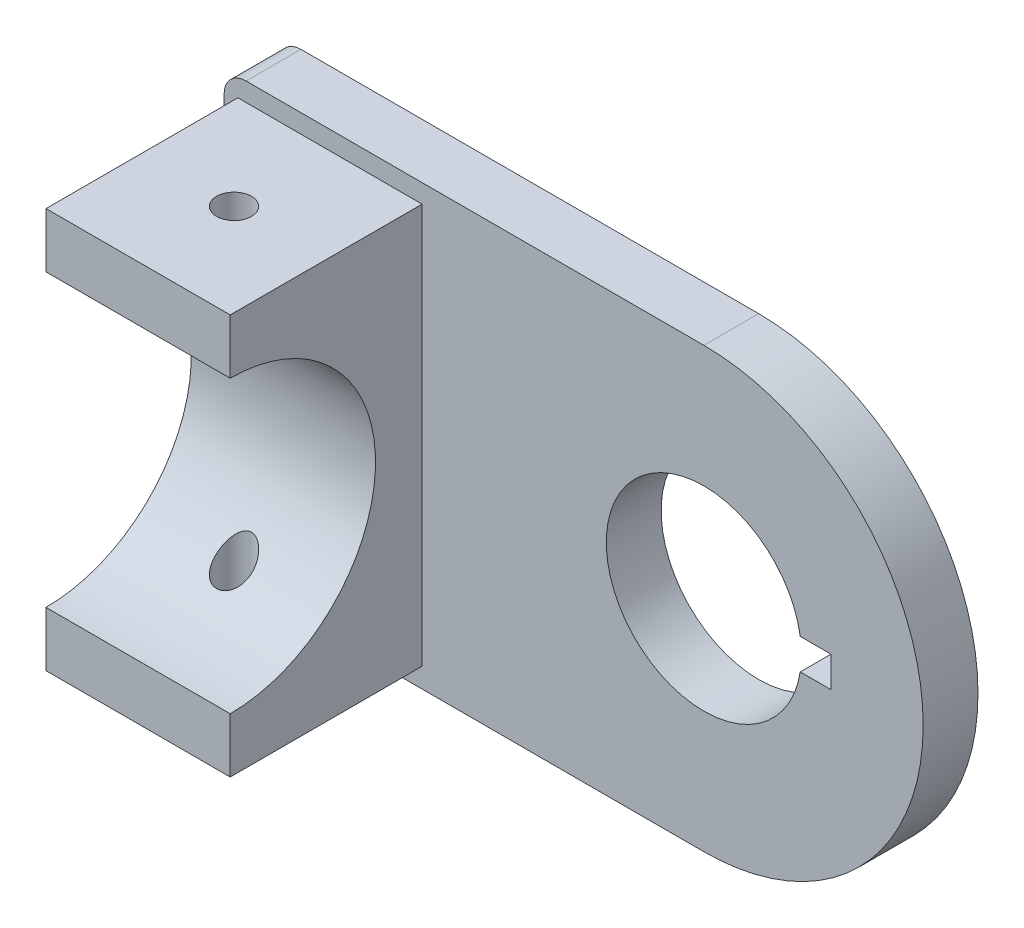
ISO-10303-21;
HEADER;
FILE_DESCRIPTION(('STEP AP214'),'2;1');
FILE_NAME('part.step','',(''),(''),'','','');
FILE_SCHEMA(('AUTOMOTIVE_DESIGN { 1 0 10303 214 1 1 1 1 }'));
ENDSEC;
DATA;
#1=APPLICATION_CONTEXT('core data for automotive mechanical design processes');
#2=APPLICATION_PROTOCOL_DEFINITION('international standard','automotive_design',2000,#1);
#3=PRODUCT_CONTEXT('',#1,'mechanical');
#4=PRODUCT('Part','Part','',(#3));
#5=PRODUCT_RELATED_PRODUCT_CATEGORY('part','',(#4));
#6=PRODUCT_DEFINITION_FORMATION('','',#4);
#7=PRODUCT_DEFINITION_CONTEXT('part definition',#1,'design');
#8=PRODUCT_DEFINITION('design','',#6,#7);
#9=PRODUCT_DEFINITION_SHAPE('','',#8);
#10=(LENGTH_UNIT() NAMED_UNIT(*) SI_UNIT(.MILLI.,.METRE.));
#11=(NAMED_UNIT(*) PLANE_ANGLE_UNIT() SI_UNIT($,.RADIAN.));
#12=(NAMED_UNIT(*) SI_UNIT($,.STERADIAN.) SOLID_ANGLE_UNIT());
#13=UNCERTAINTY_MEASURE_WITH_UNIT(LENGTH_MEASURE(1.E-05),#10,'distance_accuracy_value','');
#14=(GEOMETRIC_REPRESENTATION_CONTEXT(3) GLOBAL_UNCERTAINTY_ASSIGNED_CONTEXT((#13)) GLOBAL_UNIT_ASSIGNED_CONTEXT((#10,
#11,#12)) REPRESENTATION_CONTEXT('',''));
#15=CARTESIAN_POINT('',(0.,0.,0.));
#16=DIRECTION('',(0.,0.,1.));
#17=DIRECTION('',(1.,0.,0.));
#18=AXIS2_PLACEMENT_3D('',#15,#16,#17);
#19=CARTESIAN_POINT('',(0.,0.,28.575));
#20=DIRECTION('',(0.,0.,-1.));
#21=DIRECTION('',(-1.,0.,0.));
#22=AXIS2_PLACEMENT_3D('',#19,#20,#21);
#23=PLANE('',#22);
#24=DIRECTION('',(1.,0.,0.));
#25=VECTOR('',#24,1.);
#26=CARTESIAN_POINT('',(-190.581497037959,8.636,28.575));
#27=LINE('',#26,#25);
#28=CARTESIAN_POINT('',(1.58749999999999,8.636,28.575));
#29=VERTEX_POINT('',#28);
#30=CARTESIAN_POINT('',(22.9235,8.636,28.575));
#31=VERTEX_POINT('',#30);
#32=EDGE_CURVE('E56',#29,#31,#27,.T.);
#33=ORIENTED_EDGE('',*,*,#32,.F.);
#34=DIRECTION('',(0.,-1.,0.));
#35=VECTOR('',#34,1.);
#36=CARTESIAN_POINT('',(1.5875,2.286,28.575));
#37=LINE('',#36,#35);
#38=CARTESIAN_POINT('',(1.5875,2.286,28.575));
#39=VERTEX_POINT('',#38);
#40=EDGE_CURVE('E164',#29,#39,#37,.T.);
#41=ORIENTED_EDGE('',*,*,#40,.T.);
#42=DIRECTION('',(1.,0.,0.));
#43=VECTOR('',#42,1.);
#44=CARTESIAN_POINT('',(1.5875,2.286,28.575));
#45=LINE('',#44,#43);
#46=CARTESIAN_POINT('',(22.9235,2.286,28.575));
#47=VERTEX_POINT('',#46);
#48=EDGE_CURVE('E177',#39,#47,#45,.T.);
#49=ORIENTED_EDGE('',*,*,#48,.T.);
#50=DIRECTION('',(0.,1.,0.));
#51=VECTOR('',#50,1.);
#52=CARTESIAN_POINT('',(22.9235,2.286,28.575));
#53=LINE('',#52,#51);
#54=EDGE_CURVE('E167',#47,#31,#53,.T.);
#55=ORIENTED_EDGE('',*,*,#54,.T.);
#56=EDGE_LOOP('',(#33,#41,#49,#55));
#57=FACE_BOUND('',#56,.T.);
#58=ADVANCED_FACE('F41',(#57),#23,.F.);
#59=CARTESIAN_POINT('',(1.5875,2.286,28.575));
#60=DIRECTION('',(1.,0.,0.));
#61=DIRECTION('',(0.,0.,-1.));
#62=AXIS2_PLACEMENT_3D('',#59,#60,#61);
#63=PLANE('',#62);
#64=CARTESIAN_POINT('',(1.58749999999999,25.4635,28.575));
#65=DIRECTION('',(1.,0.,0.));
#66=DIRECTION('',(0.,0.,-1.));
#67=AXIS2_PLACEMENT_3D('',#64,#65,#66);
#68=CIRCLE('',#67,16.8275);
#69=CARTESIAN_POINT('',(1.58749999999999,42.291,28.575));
#70=VERTEX_POINT('',#69);
#71=EDGE_CURVE('E152',#70,#29,#68,.F.);
#72=ORIENTED_EDGE('',*,*,#71,.F.);
#73=CARTESIAN_POINT('',(1.5875,48.641,28.575));
#74=VERTEX_POINT('',#73);
#75=EDGE_CURVE('E174',#74,#70,#37,.T.);
#76=ORIENTED_EDGE('',*,*,#75,.F.);
#77=DIRECTION('',(0.,0.,-1.));
#78=VECTOR('',#77,1.);
#79=CARTESIAN_POINT('',(1.5875,48.641,28.575));
#80=LINE('',#79,#78);
#81=CARTESIAN_POINT('',(1.5875,48.641,6.35));
#82=VERTEX_POINT('',#81);
#83=EDGE_CURVE('E187',#74,#82,#80,.T.);
#84=ORIENTED_EDGE('',*,*,#83,.T.);
#85=DIRECTION('',(0.,-1.,0.));
#86=VECTOR('',#85,1.);
#87=CARTESIAN_POINT('',(1.5875,2.286,6.35));
#88=LINE('',#87,#86);
#89=CARTESIAN_POINT('',(1.5875,2.286,6.35));
#90=VERTEX_POINT('',#89);
#91=EDGE_CURVE('E168',#82,#90,#88,.T.);
#92=ORIENTED_EDGE('',*,*,#91,.T.);
#93=DIRECTION('',(0.,0.,-1.));
#94=VECTOR('',#93,1.);
#95=CARTESIAN_POINT('',(1.5875,2.286,28.575));
#96=LINE('',#95,#94);
#97=EDGE_CURVE('E173',#39,#90,#96,.T.);
#98=ORIENTED_EDGE('',*,*,#97,.F.);
#99=ORIENTED_EDGE('',*,*,#40,.F.);
#100=EDGE_LOOP('',(#72,#76,#84,#92,#98,#99));
#101=FACE_BOUND('',#100,.T.);
#102=ADVANCED_FACE('F171',(#101),#63,.F.);
#103=CARTESIAN_POINT('',(55.5625,25.4,6.35));
#104=DIRECTION('',(0.,0.,1.));
#105=DIRECTION('',(1.,0.,0.));
#106=AXIS2_PLACEMENT_3D('',#103,#104,#105);
#107=PLANE('',#106);
#108=CARTESIAN_POINT('',(55.5625,25.4,6.35));
#109=DIRECTION('',(0.,0.,1.));
#110=DIRECTION('',(1.,0.,0.));
#111=AXIS2_PLACEMENT_3D('',#108,#109,#110);
#112=CIRCLE('',#111,25.4);
#113=CARTESIAN_POINT('',(55.5625,0.,6.35));
#114=VERTEX_POINT('',#113);
#115=CARTESIAN_POINT('',(55.5625,50.8,6.35));
#116=VERTEX_POINT('',#115);
#117=EDGE_CURVE('E231',#114,#116,#112,.T.);
#118=ORIENTED_EDGE('',*,*,#117,.T.);
#119=DIRECTION('',(-1.,0.,0.));
#120=VECTOR('',#119,1.);
#121=CARTESIAN_POINT('',(2.54000000000002,50.8,6.35));
#122=LINE('',#121,#120);
#123=CARTESIAN_POINT('',(2.54000000000002,50.8,6.35));
#124=VERTEX_POINT('',#123);
#125=EDGE_CURVE('E234',#116,#124,#122,.T.);
#126=ORIENTED_EDGE('',*,*,#125,.T.);
#127=CARTESIAN_POINT('',(2.54,48.26,6.35));
#128=DIRECTION('',(0.,0.,1.));
#129=DIRECTION('',(1.,0.,0.));
#130=AXIS2_PLACEMENT_3D('',#127,#128,#129);
#131=CIRCLE('',#130,2.54);
#132=CARTESIAN_POINT('',(0.,48.26,6.35));
#133=VERTEX_POINT('',#132);
#134=EDGE_CURVE('E237',#124,#133,#131,.T.);
#135=ORIENTED_EDGE('',*,*,#134,.T.);
#136=DIRECTION('',(0.,-1.,0.));
#137=VECTOR('',#136,1.);
#138=CARTESIAN_POINT('',(0.,2.54000000000002,6.35));
#139=LINE('',#138,#137);
#140=CARTESIAN_POINT('',(0.,2.54000000000002,6.35));
#141=VERTEX_POINT('',#140);
#142=EDGE_CURVE('E239',#133,#141,#139,.T.);
#143=ORIENTED_EDGE('',*,*,#142,.T.);
#144=CARTESIAN_POINT('',(2.54,2.54,6.35));
#145=DIRECTION('',(0.,0.,1.));
#146=DIRECTION('',(-1.,0.,0.));
#147=AXIS2_PLACEMENT_3D('',#144,#145,#146);
#148=CIRCLE('',#147,2.54);
#149=CARTESIAN_POINT('',(2.54000000000002,0.,6.35));
#150=VERTEX_POINT('',#149);
#151=EDGE_CURVE('E241',#141,#150,#148,.T.);
#152=ORIENTED_EDGE('',*,*,#151,.T.);
#153=DIRECTION('',(1.,0.,0.));
#154=VECTOR('',#153,1.);
#155=CARTESIAN_POINT('',(2.54000000000002,0.,6.35));
#156=LINE('',#155,#154);
#157=EDGE_CURVE('E243',#150,#114,#156,.T.);
#158=ORIENTED_EDGE('',*,*,#157,.T.);
#159=EDGE_LOOP('',(#118,#126,#135,#143,#152,#158));
#160=FACE_BOUND('',#159,.T.);
#161=DIRECTION('',(1.,0.,0.));
#162=VECTOR('',#161,1.);
#163=CARTESIAN_POINT('',(70.2807813528418,23.622,6.35));
#164=LINE('',#163,#162);
#165=CARTESIAN_POINT('',(66.7247813528418,23.622,6.35));
#166=VERTEX_POINT('',#165);
#167=CARTESIAN_POINT('',(70.2807813528418,23.622,6.35));
#168=VERTEX_POINT('',#167);
#169=EDGE_CURVE('E202',#166,#168,#164,.T.);
#170=ORIENTED_EDGE('',*,*,#169,.F.);
#171=CARTESIAN_POINT('',(55.5625,25.4,6.35));
#172=DIRECTION('',(0.,0.,1.));
#173=DIRECTION('',(1.,0.,0.));
#174=AXIS2_PLACEMENT_3D('',#171,#172,#173);
#175=CIRCLE('',#174,11.303);
#176=CARTESIAN_POINT('',(66.7247813528418,27.178,6.35));
#177=VERTEX_POINT('',#176);
#178=EDGE_CURVE('E200',#177,#166,#175,.T.);
#179=ORIENTED_EDGE('',*,*,#178,.F.);
#180=DIRECTION('',(-1.,0.,0.));
#181=VECTOR('',#180,1.);
#182=CARTESIAN_POINT('',(66.7247813528418,27.178,6.35));
#183=LINE('',#182,#181);
#184=CARTESIAN_POINT('',(70.2807813528418,27.178,6.35));
#185=VERTEX_POINT('',#184);
#186=EDGE_CURVE('E208',#185,#177,#183,.T.);
#187=ORIENTED_EDGE('',*,*,#186,.F.);
#188=DIRECTION('',(0.,1.,0.));
#189=VECTOR('',#188,1.);
#190=CARTESIAN_POINT('',(70.2807813528418,27.178,6.35));
#191=LINE('',#190,#189);
#192=EDGE_CURVE('E205',#168,#185,#191,.T.);
#193=ORIENTED_EDGE('',*,*,#192,.F.);
#194=EDGE_LOOP('',(#170,#179,#187,#193));
#195=FACE_BOUND('',#194,.T.);
#196=DIRECTION('',(1.,0.,0.));
#197=VECTOR('',#196,1.);
#198=CARTESIAN_POINT('',(1.5875,2.286,6.35));
#199=LINE('',#198,#197);
#200=CARTESIAN_POINT('',(22.9235,2.286,6.35));
#201=VERTEX_POINT('',#200);
#202=EDGE_CURVE('E189',#90,#201,#199,.T.);
#203=ORIENTED_EDGE('',*,*,#202,.F.);
#204=ORIENTED_EDGE('',*,*,#91,.F.);
#205=DIRECTION('',(-1.,0.,0.));
#206=VECTOR('',#205,1.);
#207=CARTESIAN_POINT('',(1.5875,48.641,6.35));
#208=LINE('',#207,#206);
#209=CARTESIAN_POINT('',(22.9235,48.641,6.35));
#210=VERTEX_POINT('',#209);
#211=EDGE_CURVE('E175',#210,#82,#208,.T.);
#212=ORIENTED_EDGE('',*,*,#211,.F.);
#213=DIRECTION('',(0.,1.,0.));
#214=VECTOR('',#213,1.);
#215=CARTESIAN_POINT('',(22.9235,2.286,6.35));
#216=LINE('',#215,#214);
#217=EDGE_CURVE('E178',#201,#210,#216,.T.);
#218=ORIENTED_EDGE('',*,*,#217,.F.);
#219=EDGE_LOOP('',(#203,#204,#212,#218));
#220=FACE_BOUND('',#219,.T.);
#221=ADVANCED_FACE('F296',(#160,#195,#220),#107,.T.);
#222=CARTESIAN_POINT('',(55.5625,25.4,0.));
#223=DIRECTION('',(0.,0.,1.));
#224=DIRECTION('',(1.,0.,0.));
#225=AXIS2_PLACEMENT_3D('',#222,#223,#224);
#226=PLANE('',#225);
#227=CARTESIAN_POINT('',(55.5625,25.4,0.));
#228=DIRECTION('',(0.,0.,1.));
#229=DIRECTION('',(1.,0.,0.));
#230=AXIS2_PLACEMENT_3D('',#227,#228,#229);
#231=CIRCLE('',#230,25.4);
#232=CARTESIAN_POINT('',(55.5625,0.,0.));
#233=VERTEX_POINT('',#232);
#234=CARTESIAN_POINT('',(55.5625,50.8,0.));
#235=VERTEX_POINT('',#234);
#236=EDGE_CURVE('E230',#233,#235,#231,.T.);
#237=ORIENTED_EDGE('',*,*,#236,.F.);
#238=DIRECTION('',(1.,0.,0.));
#239=VECTOR('',#238,1.);
#240=CARTESIAN_POINT('',(2.54000000000002,0.,0.));
#241=LINE('',#240,#239);
#242=CARTESIAN_POINT('',(2.54000000000002,0.,0.));
#243=VERTEX_POINT('',#242);
#244=EDGE_CURVE('E235',#243,#233,#241,.T.);
#245=ORIENTED_EDGE('',*,*,#244,.F.);
#246=CARTESIAN_POINT('',(2.54,2.54,0.));
#247=DIRECTION('',(0.,0.,1.));
#248=DIRECTION('',(-1.,0.,0.));
#249=AXIS2_PLACEMENT_3D('',#246,#247,#248);
#250=CIRCLE('',#249,2.54);
#251=CARTESIAN_POINT('',(0.,2.54000000000002,0.));
#252=VERTEX_POINT('',#251);
#253=EDGE_CURVE('E254',#252,#243,#250,.T.);
#254=ORIENTED_EDGE('',*,*,#253,.F.);
#255=DIRECTION('',(0.,-1.,0.));
#256=VECTOR('',#255,1.);
#257=CARTESIAN_POINT('',(0.,2.54000000000002,0.));
#258=LINE('',#257,#256);
#259=CARTESIAN_POINT('',(0.,48.26,0.));
#260=VERTEX_POINT('',#259);
#261=EDGE_CURVE('E252',#260,#252,#258,.T.);
#262=ORIENTED_EDGE('',*,*,#261,.F.);
#263=CARTESIAN_POINT('',(2.54,48.26,0.));
#264=DIRECTION('',(0.,0.,1.));
#265=DIRECTION('',(1.,0.,0.));
#266=AXIS2_PLACEMENT_3D('',#263,#264,#265);
#267=CIRCLE('',#266,2.54);
#268=CARTESIAN_POINT('',(2.54000000000002,50.8,0.));
#269=VERTEX_POINT('',#268);
#270=EDGE_CURVE('E250',#269,#260,#267,.T.);
#271=ORIENTED_EDGE('',*,*,#270,.F.);
#272=DIRECTION('',(-1.,0.,0.));
#273=VECTOR('',#272,1.);
#274=CARTESIAN_POINT('',(2.54000000000002,50.8,0.));
#275=LINE('',#274,#273);
#276=EDGE_CURVE('E248',#235,#269,#275,.T.);
#277=ORIENTED_EDGE('',*,*,#276,.F.);
#278=EDGE_LOOP('',(#237,#245,#254,#262,#271,#277));
#279=FACE_BOUND('',#278,.T.);
#280=CARTESIAN_POINT('',(55.5625,25.4,0.));
#281=DIRECTION('',(0.,0.,1.));
#282=DIRECTION('',(1.,0.,0.));
#283=AXIS2_PLACEMENT_3D('',#280,#281,#282);
#284=CIRCLE('',#283,11.303);
#285=CARTESIAN_POINT('',(66.7247813528418,27.178,0.));
#286=VERTEX_POINT('',#285);
#287=CARTESIAN_POINT('',(66.7247813528418,23.622,0.));
#288=VERTEX_POINT('',#287);
#289=EDGE_CURVE('E199',#286,#288,#284,.T.);
#290=ORIENTED_EDGE('',*,*,#289,.T.);
#291=DIRECTION('',(1.,0.,0.));
#292=VECTOR('',#291,1.);
#293=CARTESIAN_POINT('',(70.2807813528418,23.622,0.));
#294=LINE('',#293,#292);
#295=CARTESIAN_POINT('',(70.2807813528418,23.622,0.));
#296=VERTEX_POINT('',#295);
#297=EDGE_CURVE('E213',#288,#296,#294,.T.);
#298=ORIENTED_EDGE('',*,*,#297,.T.);
#299=DIRECTION('',(0.,1.,0.));
#300=VECTOR('',#299,1.);
#301=CARTESIAN_POINT('',(70.2807813528418,27.178,0.));
#302=LINE('',#301,#300);
#303=CARTESIAN_POINT('',(70.2807813528418,27.178,0.));
#304=VERTEX_POINT('',#303);
#305=EDGE_CURVE('E216',#296,#304,#302,.T.);
#306=ORIENTED_EDGE('',*,*,#305,.T.);
#307=DIRECTION('',(-1.,0.,0.));
#308=VECTOR('',#307,1.);
#309=CARTESIAN_POINT('',(66.7247813528418,27.178,0.));
#310=LINE('',#309,#308);
#311=EDGE_CURVE('E203',#304,#286,#310,.T.);
#312=ORIENTED_EDGE('',*,*,#311,.T.);
#313=EDGE_LOOP('',(#290,#298,#306,#312));
#314=FACE_BOUND('',#313,.T.);
#315=ADVANCED_FACE('F281',(#279,#314),#226,.F.);
#316=CARTESIAN_POINT('',(55.5625,25.4,6.35));
#317=DIRECTION('',(0.,0.,-1.));
#318=DIRECTION('',(-1.,0.,0.));
#319=AXIS2_PLACEMENT_3D('',#316,#317,#318);
#320=CYLINDRICAL_SURFACE('',#319,25.4);
#321=ORIENTED_EDGE('',*,*,#236,.T.);
#322=DIRECTION('',(0.,0.,-1.));
#323=VECTOR('',#322,1.);
#324=CARTESIAN_POINT('',(55.5625,50.8,6.35));
#325=LINE('',#324,#323);
#326=EDGE_CURVE('E49',#116,#235,#325,.T.);
#327=ORIENTED_EDGE('',*,*,#326,.F.);
#328=ORIENTED_EDGE('',*,*,#117,.F.);
#329=DIRECTION('',(0.,0.,-1.));
#330=VECTOR('',#329,1.);
#331=CARTESIAN_POINT('',(55.5625,0.,6.35));
#332=LINE('',#331,#330);
#333=EDGE_CURVE('E245',#114,#233,#332,.T.);
#334=ORIENTED_EDGE('',*,*,#333,.T.);
#335=EDGE_LOOP('',(#321,#327,#328,#334));
#336=FACE_BOUND('',#335,.T.);
#337=ADVANCED_FACE('F43',(#336),#320,.T.);
#338=CARTESIAN_POINT('',(2.54000000000002,50.8,6.35));
#339=DIRECTION('',(0.,-1.,0.));
#340=DIRECTION('',(0.,0.,-1.));
#341=AXIS2_PLACEMENT_3D('',#338,#339,#340);
#342=PLANE('',#341);
#343=ORIENTED_EDGE('',*,*,#276,.T.);
#344=DIRECTION('',(0.,0.,-1.));
#345=VECTOR('',#344,1.);
#346=CARTESIAN_POINT('',(2.54000000000002,50.8,6.35));
#347=LINE('',#346,#345);
#348=EDGE_CURVE('E268',#124,#269,#347,.T.);
#349=ORIENTED_EDGE('',*,*,#348,.F.);
#350=ORIENTED_EDGE('',*,*,#125,.F.);
#351=ORIENTED_EDGE('',*,*,#326,.T.);
#352=EDGE_LOOP('',(#343,#349,#350,#351));
#353=FACE_BOUND('',#352,.T.);
#354=ADVANCED_FACE('F273',(#353),#342,.F.);
#355=CARTESIAN_POINT('',(2.54,48.26,6.35));
#356=DIRECTION('',(0.,0.,-1.));
#357=DIRECTION('',(-1.,0.,0.));
#358=AXIS2_PLACEMENT_3D('',#355,#356,#357);
#359=CYLINDRICAL_SURFACE('',#358,2.54);
#360=ORIENTED_EDGE('',*,*,#270,.T.);
#361=DIRECTION('',(0.,0.,-1.));
#362=VECTOR('',#361,1.);
#363=CARTESIAN_POINT('',(0.,48.26,6.35));
#364=LINE('',#363,#362);
#365=EDGE_CURVE('E265',#133,#260,#364,.T.);
#366=ORIENTED_EDGE('',*,*,#365,.F.);
#367=ORIENTED_EDGE('',*,*,#134,.F.);
#368=ORIENTED_EDGE('',*,*,#348,.T.);
#369=EDGE_LOOP('',(#360,#366,#367,#368));
#370=FACE_BOUND('',#369,.T.);
#371=ADVANCED_FACE('F288',(#370),#359,.T.);
#372=CARTESIAN_POINT('',(0.,2.54000000000002,6.35));
#373=DIRECTION('',(1.,0.,0.));
#374=DIRECTION('',(0.,0.,-1.));
#375=AXIS2_PLACEMENT_3D('',#372,#373,#374);
#376=PLANE('',#375);
#377=ORIENTED_EDGE('',*,*,#261,.T.);
#378=DIRECTION('',(0.,0.,-1.));
#379=VECTOR('',#378,1.);
#380=CARTESIAN_POINT('',(0.,2.54000000000002,6.35));
#381=LINE('',#380,#379);
#382=EDGE_CURVE('E262',#141,#252,#381,.T.);
#383=ORIENTED_EDGE('',*,*,#382,.F.);
#384=ORIENTED_EDGE('',*,*,#142,.F.);
#385=ORIENTED_EDGE('',*,*,#365,.T.);
#386=EDGE_LOOP('',(#377,#383,#384,#385));
#387=FACE_BOUND('',#386,.T.);
#388=ADVANCED_FACE('F292',(#387),#376,.F.);
#389=CARTESIAN_POINT('',(2.54,2.54,6.35));
#390=DIRECTION('',(0.,0.,-1.));
#391=DIRECTION('',(-1.,0.,0.));
#392=AXIS2_PLACEMENT_3D('',#389,#390,#391);
#393=CYLINDRICAL_SURFACE('',#392,2.54);
#394=ORIENTED_EDGE('',*,*,#253,.T.);
#395=DIRECTION('',(0.,0.,-1.));
#396=VECTOR('',#395,1.);
#397=CARTESIAN_POINT('',(2.54000000000002,0.,6.35));
#398=LINE('',#397,#396);
#399=EDGE_CURVE('E259',#150,#243,#398,.T.);
#400=ORIENTED_EDGE('',*,*,#399,.F.);
#401=ORIENTED_EDGE('',*,*,#151,.F.);
#402=ORIENTED_EDGE('',*,*,#382,.T.);
#403=EDGE_LOOP('',(#394,#400,#401,#402));
#404=FACE_BOUND('',#403,.T.);
#405=ADVANCED_FACE('F303',(#404),#393,.T.);
#406=CARTESIAN_POINT('',(2.54000000000002,0.,6.35));
#407=DIRECTION('',(0.,1.,0.));
#408=DIRECTION('',(0.,0.,1.));
#409=AXIS2_PLACEMENT_3D('',#406,#407,#408);
#410=PLANE('',#409);
#411=ORIENTED_EDGE('',*,*,#244,.T.);
#412=ORIENTED_EDGE('',*,*,#333,.F.);
#413=ORIENTED_EDGE('',*,*,#157,.F.);
#414=ORIENTED_EDGE('',*,*,#399,.T.);
#415=EDGE_LOOP('',(#411,#412,#413,#414));
#416=FACE_BOUND('',#415,.T.);
#417=ADVANCED_FACE('F301',(#416),#410,.F.);
#418=CARTESIAN_POINT('',(55.5625,25.4,6.35));
#419=DIRECTION('',(0.,0.,-1.));
#420=DIRECTION('',(-1.,0.,0.));
#421=AXIS2_PLACEMENT_3D('',#418,#419,#420);
#422=CYLINDRICAL_SURFACE('',#421,11.303);
#423=ORIENTED_EDGE('',*,*,#289,.F.);
#424=DIRECTION('',(0.,0.,-1.));
#425=VECTOR('',#424,1.);
#426=CARTESIAN_POINT('',(66.7247813528418,27.178,6.35));
#427=LINE('',#426,#425);
#428=EDGE_CURVE('E210',#177,#286,#427,.T.);
#429=ORIENTED_EDGE('',*,*,#428,.F.);
#430=ORIENTED_EDGE('',*,*,#178,.T.);
#431=DIRECTION('',(0.,0.,-1.));
#432=VECTOR('',#431,1.);
#433=CARTESIAN_POINT('',(66.7247813528418,23.622,6.35));
#434=LINE('',#433,#432);
#435=EDGE_CURVE('E227',#166,#288,#434,.T.);
#436=ORIENTED_EDGE('',*,*,#435,.T.);
#437=EDGE_LOOP('',(#423,#429,#430,#436));
#438=FACE_BOUND('',#437,.T.);
#439=ADVANCED_FACE('F310',(#438),#422,.F.);
#440=CARTESIAN_POINT('',(70.2807813528418,23.622,6.35));
#441=DIRECTION('',(0.,1.,0.));
#442=DIRECTION('',(-1.,0.,0.));
#443=AXIS2_PLACEMENT_3D('',#440,#441,#442);
#444=PLANE('',#443);
#445=ORIENTED_EDGE('',*,*,#297,.F.);
#446=ORIENTED_EDGE('',*,*,#435,.F.);
#447=ORIENTED_EDGE('',*,*,#169,.T.);
#448=DIRECTION('',(0.,0.,-1.));
#449=VECTOR('',#448,1.);
#450=CARTESIAN_POINT('',(70.2807813528418,23.622,6.35));
#451=LINE('',#450,#449);
#452=EDGE_CURVE('E225',#168,#296,#451,.T.);
#453=ORIENTED_EDGE('',*,*,#452,.T.);
#454=EDGE_LOOP('',(#445,#446,#447,#453));
#455=FACE_BOUND('',#454,.T.);
#456=ADVANCED_FACE('F359',(#455),#444,.T.);
#457=CARTESIAN_POINT('',(70.2807813528418,27.178,6.35));
#458=DIRECTION('',(-1.,0.,0.));
#459=DIRECTION('',(0.,0.,1.));
#460=AXIS2_PLACEMENT_3D('',#457,#458,#459);
#461=PLANE('',#460);
#462=ORIENTED_EDGE('',*,*,#305,.F.);
#463=ORIENTED_EDGE('',*,*,#452,.F.);
#464=ORIENTED_EDGE('',*,*,#192,.T.);
#465=DIRECTION('',(0.,0.,-1.));
#466=VECTOR('',#465,1.);
#467=CARTESIAN_POINT('',(70.2807813528418,27.178,6.35));
#468=LINE('',#467,#466);
#469=EDGE_CURVE('E223',#185,#304,#468,.T.);
#470=ORIENTED_EDGE('',*,*,#469,.T.);
#471=EDGE_LOOP('',(#462,#463,#464,#470));
#472=FACE_BOUND('',#471,.T.);
#473=ADVANCED_FACE('F355',(#472),#461,.T.);
#474=CARTESIAN_POINT('',(66.7247813528418,27.178,6.35));
#475=DIRECTION('',(0.,-1.,0.));
#476=DIRECTION('',(0.,0.,-1.));
#477=AXIS2_PLACEMENT_3D('',#474,#475,#476);
#478=PLANE('',#477);
#479=ORIENTED_EDGE('',*,*,#311,.F.);
#480=ORIENTED_EDGE('',*,*,#469,.F.);
#481=ORIENTED_EDGE('',*,*,#186,.T.);
#482=ORIENTED_EDGE('',*,*,#428,.T.);
#483=EDGE_LOOP('',(#479,#480,#481,#482));
#484=FACE_BOUND('',#483,.T.);
#485=ADVANCED_FACE('F349',(#484),#478,.T.);
#486=CARTESIAN_POINT('',(1.5875,2.286,28.575));
#487=DIRECTION('',(0.,1.,0.));
#488=DIRECTION('',(0.,0.,1.));
#489=AXIS2_PLACEMENT_3D('',#486,#487,#488);
#490=PLANE('',#489);
#491=CARTESIAN_POINT('',(12.2555,2.286,17.4625));
#492=DIRECTION('',(0.,-1.,0.));
#493=DIRECTION('',(0.,0.,-1.));
#494=AXIS2_PLACEMENT_3D('',#491,#492,#493);
#495=CIRCLE('',#494,2.0193);
#496=CARTESIAN_POINT('',(12.2555,2.286,15.4432));
#497=VERTEX_POINT('',#496);
#498=EDGE_CURVE('E530',#497,#497,#495,.T.);
#499=ORIENTED_EDGE('',*,*,#498,.F.);
#500=EDGE_LOOP('',(#499));
#501=FACE_BOUND('',#500,.T.);
#502=ORIENTED_EDGE('',*,*,#202,.T.);
#503=DIRECTION('',(0.,0.,-1.));
#504=VECTOR('',#503,1.);
#505=CARTESIAN_POINT('',(22.9235,2.286,28.575));
#506=LINE('',#505,#504);
#507=EDGE_CURVE('E195',#47,#201,#506,.T.);
#508=ORIENTED_EDGE('',*,*,#507,.F.);
#509=ORIENTED_EDGE('',*,*,#48,.F.);
#510=ORIENTED_EDGE('',*,*,#97,.T.);
#511=EDGE_LOOP('',(#502,#508,#509,#510));
#512=FACE_BOUND('',#511,.T.);
#513=ADVANCED_FACE('F342',(#501,#512),#490,.F.);
#514=CARTESIAN_POINT('',(22.9235,2.286,28.575));
#515=DIRECTION('',(-1.,0.,0.));
#516=DIRECTION('',(0.,0.,1.));
#517=AXIS2_PLACEMENT_3D('',#514,#515,#516);
#518=PLANE('',#517);
#519=CARTESIAN_POINT('',(22.9235,42.291,28.575));
#520=VERTEX_POINT('',#519);
#521=CARTESIAN_POINT('',(22.9235,48.641,28.575));
#522=VERTEX_POINT('',#521);
#523=EDGE_CURVE('E183',#520,#522,#53,.T.);
#524=ORIENTED_EDGE('',*,*,#523,.F.);
#525=CARTESIAN_POINT('',(22.9235,25.4635,28.575));
#526=DIRECTION('',(-1.,0.,0.));
#527=DIRECTION('',(0.,0.,1.));
#528=AXIS2_PLACEMENT_3D('',#525,#526,#527);
#529=CIRCLE('',#528,16.8275);
#530=EDGE_CURVE('E11',#520,#31,#529,.T.);
#531=ORIENTED_EDGE('',*,*,#530,.T.);
#532=ORIENTED_EDGE('',*,*,#54,.F.);
#533=ORIENTED_EDGE('',*,*,#507,.T.);
#534=ORIENTED_EDGE('',*,*,#217,.T.);
#535=DIRECTION('',(0.,0.,-1.));
#536=VECTOR('',#535,1.);
#537=CARTESIAN_POINT('',(22.9235,48.641,28.575));
#538=LINE('',#537,#536);
#539=EDGE_CURVE('E63',#522,#210,#538,.T.);
#540=ORIENTED_EDGE('',*,*,#539,.F.);
#541=EDGE_LOOP('',(#524,#531,#532,#533,#534,#540));
#542=FACE_BOUND('',#541,.T.);
#543=ADVANCED_FACE('F331',(#542),#518,.F.);
#544=CARTESIAN_POINT('',(1.5875,48.641,28.575));
#545=DIRECTION('',(0.,-1.,0.));
#546=DIRECTION('',(0.,0.,-1.));
#547=AXIS2_PLACEMENT_3D('',#544,#545,#546);
#548=PLANE('',#547);
#549=CARTESIAN_POINT('',(12.2555,48.641,17.4625));
#550=DIRECTION('',(0.,1.,0.));
#551=DIRECTION('',(0.,0.,1.));
#552=AXIS2_PLACEMENT_3D('',#549,#550,#551);
#553=CIRCLE('',#552,2.0193);
#554=CARTESIAN_POINT('',(12.2555,48.641,19.4818));
#555=VERTEX_POINT('',#554);
#556=EDGE_CURVE('E529',#555,#555,#553,.T.);
#557=ORIENTED_EDGE('',*,*,#556,.F.);
#558=EDGE_LOOP('',(#557));
#559=FACE_BOUND('',#558,.T.);
#560=ORIENTED_EDGE('',*,*,#211,.T.);
#561=ORIENTED_EDGE('',*,*,#83,.F.);
#562=DIRECTION('',(-1.,0.,0.));
#563=VECTOR('',#562,1.);
#564=CARTESIAN_POINT('',(1.5875,48.641,28.575));
#565=LINE('',#564,#563);
#566=EDGE_CURVE('E185',#522,#74,#565,.T.);
#567=ORIENTED_EDGE('',*,*,#566,.F.);
#568=ORIENTED_EDGE('',*,*,#539,.T.);
#569=EDGE_LOOP('',(#560,#561,#567,#568));
#570=FACE_BOUND('',#569,.T.);
#571=ADVANCED_FACE('F323',(#559,#570),#548,.F.);
#572=ORIENTED_EDGE('',*,*,#75,.T.);
#573=DIRECTION('',(1.,0.,0.));
#574=VECTOR('',#573,1.);
#575=CARTESIAN_POINT('',(-190.581497037959,42.291,28.575));
#576=LINE('',#575,#574);
#577=EDGE_CURVE('E155',#70,#520,#576,.T.);
#578=ORIENTED_EDGE('',*,*,#577,.T.);
#579=ORIENTED_EDGE('',*,*,#523,.T.);
#580=ORIENTED_EDGE('',*,*,#566,.T.);
#581=EDGE_LOOP('',(#572,#578,#579,#580));
#582=FACE_BOUND('',#581,.T.);
#583=ADVANCED_FACE('F315',(#582),#23,.F.);
#584=CARTESIAN_POINT('',(-190.581497037959,25.4635,28.575));
#585=DIRECTION('',(1.,0.,0.));
#586=DIRECTION('',(0.,0.,-1.));
#587=AXIS2_PLACEMENT_3D('',#584,#585,#586);
#588=CYLINDRICAL_SURFACE('',#587,16.8275);
#589=CARTESIAN_POINT('',(12.2555,14.9411150512348,15.4432));
#590=CARTESIAN_POINT('',(12.1699356578506,14.9411016415711,15.4432095513431));
#591=CARTESIAN_POINT('',(12.0842790674387,14.9342354369666,15.4487034848355));
#592=CARTESIAN_POINT('',(11.9162874318763,14.9076405279394,15.4700828695973));
#593=CARTESIAN_POINT('',(11.8339596398287,14.8878851909982,15.4859898373088));
#594=CARTESIAN_POINT('',(11.6759039524595,14.8379895266229,15.5264641373657));
#595=CARTESIAN_POINT('',(11.6001153554763,14.8079614844578,15.5509378953145));
#596=CARTESIAN_POINT('',(11.4551476471965,14.7398610551267,15.6069518368225));
#597=CARTESIAN_POINT('',(11.3859710611018,14.7017856122532,15.6384947048944));
#598=CARTESIAN_POINT('',(11.2168925456849,14.5962577251542,15.7268559200963));
#599=CARTESIAN_POINT('',(11.1219199883849,14.5244215926134,15.7878402525376));
#600=CARTESIAN_POINT('',(10.9476151950222,14.3716887999855,15.9200896976639));
#601=CARTESIAN_POINT('',(10.8683278227812,14.2907671589523,15.9913833189319));
#602=CARTESIAN_POINT('',(10.744759628862,14.1472159794849,16.1205629049773));
#603=CARTESIAN_POINT('',(10.6969181006546,14.0858798199822,16.1765440686466));
#604=CARTESIAN_POINT('',(10.6084352610237,13.9613185572277,16.2920114291321));
#605=CARTESIAN_POINT('',(10.5677969447037,13.8980926809392,16.3514990703098));
#606=CARTESIAN_POINT('',(10.456352187871,13.7066481535002,16.5345583532337));
#607=CARTESIAN_POINT('',(10.3959893234008,13.576630601312,16.6627549361332));
#608=CARTESIAN_POINT('',(10.3020619520853,13.3135002016262,16.9311850409237));
#609=CARTESIAN_POINT('',(10.2690928285601,13.1803801795529,17.0716161581752));
#610=CARTESIAN_POINT('',(10.2336642883027,12.9173046869057,17.3591379206127));
#611=CARTESIAN_POINT('',(10.231178080716,12.7873465377091,17.5062226039574));
#612=CARTESIAN_POINT('',(10.2572642796044,12.5545119955642,17.7791824999932));
#613=CARTESIAN_POINT('',(10.2809159236202,12.4506366869016,17.9046729802457));
#614=CARTESIAN_POINT('',(10.3538746179003,12.2501100296306,18.1540334608993));
#615=CARTESIAN_POINT('',(10.4031527696218,12.1534506838277,18.2779051258431));
#616=CARTESIAN_POINT('',(10.5167995235386,11.9884623585828,18.4951716415236));
#617=CARTESIAN_POINT('',(10.5762543671984,11.9183116627291,18.5897478821959));
#618=CARTESIAN_POINT('',(10.7134917034809,11.7864142508431,18.7711940637232));
#619=CARTESIAN_POINT('',(10.7912538615288,11.724658329633,18.8580724085913));
#620=CARTESIAN_POINT('',(10.9511675290728,11.6204423115763,19.0072685088447));
#621=CARTESIAN_POINT('',(11.0307299794908,11.5764749572505,19.0713023737583));
#622=CARTESIAN_POINT('',(11.2016730663091,11.4972557392276,19.1881070027119));
#623=CARTESIAN_POINT('',(11.2930503583586,11.4620014173794,19.2408809428655));
#624=CARTESIAN_POINT('',(11.4862478718876,11.4012781726949,19.3326117934633));
#625=CARTESIAN_POINT('',(11.5881244625982,11.3758659698765,19.3714885183533));
#626=CARTESIAN_POINT('',(11.7988335710436,11.3361707330385,19.4325345080121));
#627=CARTESIAN_POINT('',(11.9076624495214,11.3218819271696,19.4547124374677));
#628=CARTESIAN_POINT('',(12.1168153797712,11.3059341897115,19.4794916405876));
#629=CARTESIAN_POINT('',(12.2168412289951,11.3031124778907,19.4838949302076));
#630=CARTESIAN_POINT('',(12.4162385054194,11.306988876083,19.4778595215888));
#631=CARTESIAN_POINT('',(12.5156101284871,11.3136839932774,19.4674254893378));
#632=CARTESIAN_POINT('',(12.7068009244641,11.3358880005373,19.4330240462793));
#633=CARTESIAN_POINT('',(12.7987633121831,11.3510364638386,19.4096103062033));
#634=CARTESIAN_POINT('',(12.9769920964427,11.3893796804822,19.3508406082465));
#635=CARTESIAN_POINT('',(13.0632579934487,11.4125751383664,19.3154836046992));
#636=CARTESIAN_POINT('',(13.2319871337514,11.4675364558742,19.2326057559426));
#637=CARTESIAN_POINT('',(13.3141050712377,11.4996407312525,19.1846095258348));
#638=CARTESIAN_POINT('',(13.4687470001708,11.5709712731006,19.0793990297012));
#639=CARTESIAN_POINT('',(13.541267507876,11.6102001135035,19.0221814330624));
#640=CARTESIAN_POINT('',(13.6837317034251,11.69972428995,18.8935722943485));
#641=CARTESIAN_POINT('',(13.7524080737901,11.7507747167364,18.8213068479295));
#642=CARTESIAN_POINT('',(13.8765376628809,11.8592698880535,18.6705403153324));
#643=CARTESIAN_POINT('',(13.9319839103938,11.9167179803611,18.5920359706688));
#644=CARTESIAN_POINT('',(14.0383208088784,12.0472279278447,18.4171341104636));
#645=CARTESIAN_POINT('',(14.0867688761034,12.1212724931978,18.3199886889207));
#646=CARTESIAN_POINT('',(14.1666270474897,12.2748933607146,18.1231558142368));
#647=CARTESIAN_POINT('',(14.1980269401945,12.3544729461069,18.02346687493));
#648=CARTESIAN_POINT('',(14.2497788287333,12.5348841715818,17.802816528718));
#649=CARTESIAN_POINT('',(14.2664379169776,12.636675237288,17.6817741020631));
#650=CARTESIAN_POINT('',(14.2782659603338,12.8441911842724,17.4420298796307));
#651=CARTESIAN_POINT('',(14.2734169106816,12.9499192878659,17.3233301284515));
#652=CARTESIAN_POINT('',(14.2406619980107,13.1850945469385,17.0666730589739));
#653=CARTESIAN_POINT('',(14.2082750924432,13.3149994163727,16.9296984107961));
#654=CARTESIAN_POINT('',(14.1158948899108,13.5745072788237,16.6648788458238));
#655=CARTESIAN_POINT('',(14.0558841435208,13.7041100289118,16.537039758834));
#656=CARTESIAN_POINT('',(13.9191851299981,13.9396951596551,16.3116734196813));
#657=CARTESIAN_POINT('',(13.8463386200426,14.0463089749356,16.2124734370572));
#658=CARTESIAN_POINT('',(13.6793971041079,14.2524869794934,16.0252121934963));
#659=CARTESIAN_POINT('',(13.5853443036526,14.3520646622546,15.9371293426842));
#660=CARTESIAN_POINT('',(13.4110229315673,14.5054318336155,15.8042537113093));
#661=CARTESIAN_POINT('',(13.3374522046498,14.5630485303773,15.7550998577197));
#662=CARTESIAN_POINT('',(13.1799206156072,14.6699872348987,15.6649382133258));
#663=CARTESIAN_POINT('',(13.0959737190605,14.7193201854118,15.6239196626682));
#664=CARTESIAN_POINT('',(12.9376096387387,14.7963729295273,15.5604279171211));
#665=CARTESIAN_POINT('',(12.865197486791,14.8264596754362,15.5358594260761));
#666=CARTESIAN_POINT('',(12.7150336181281,14.8771715105713,15.4946528083598));
#667=CARTESIAN_POINT('',(12.6372942487438,14.8978176814271,15.4779970086815));
#668=CARTESIAN_POINT('',(12.5083690824256,14.9220812195344,15.4584689900034));
#669=CARTESIAN_POINT('',(12.4582447725654,14.9291850695577,15.4527667582972));
#670=CARTESIAN_POINT('',(12.3572579469604,14.9387064193105,15.4451290643599));
#671=CARTESIAN_POINT('',(12.3063952926402,14.941123027557,15.4431943186801));
#672=CARTESIAN_POINT('',(12.2555,14.9411150512348,15.4432));
#673=B_SPLINE_CURVE_WITH_KNOTS('',3,(#589,#590,#591,#592,#593,#594,#595,#596,#597,#598,#599,
#600,#601,#602,#603,#604,#605,#606,#607,#608,#609,#610,#611,#612,#613,#614,#615,#616,#617,#618,
#619,#620,#621,#622,#623,#624,#625,#626,#627,#628,#629,#630,#631,#632,#633,#634,#635,#636,#637,
#638,#639,#640,#641,#642,#643,#644,#645,#646,#647,#648,#649,#650,#651,#652,#653,#654,#655,#656,
#657,#658,#659,#660,#661,#662,#663,#664,#665,#666,#667,#668,#669,#670,#671,#672),.UNSPECIFIED.,
.T.,.F.,(4,2,2,2,2,2,2,2,2,2,2,2,2,2,2,2,2,2,2,2,2,2,2,2,2,2,2,2,2,2,2,2,2,2,2,2,2,2,2,2,2,4),
(0.,0.256436398858405,0.513404351664277,0.767648809030423,1.02198998047816,1.42113290752533,
1.82140148809985,2.10855268706734,2.3958230051524,2.97021397583215,3.55678455218835,
4.14283956584319,4.6348346820208,5.12627618357393,5.52049822778212,5.91428444463147,
6.24647663485577,6.5785749986023,6.91255973199786,7.24637104742587,7.54533383893099,
7.8442026344772,8.13120736625176,8.41823723261794,8.71817098039736,9.01821330332716,
9.3529454735593,9.68785363320573,10.0806305420937,10.4736424563154,10.9489940045375,
11.4247435512806,11.9970777893668,12.5697740566617,13.0567329635127,13.5427311305204,
13.8586219401783,14.1740921209186,14.419717150939,14.6647909674544,14.8172951959423,
14.9698284269078),.UNSPECIFIED.);
#674=CARTESIAN_POINT('',(12.2555,14.9411150512348,15.4432));
#675=VERTEX_POINT('',#674);
#676=EDGE_CURVE('E524',#675,#675,#673,.T.);
#677=ORIENTED_EDGE('',*,*,#676,.F.);
#678=EDGE_LOOP('',(#677));
#679=FACE_BOUND('',#678,.T.);
#680=CARTESIAN_POINT('',(12.2555,39.6225419877194,19.4818));
#681=CARTESIAN_POINT('',(12.3549608533472,39.6225389262694,19.4817936177022));
#682=CARTESIAN_POINT('',(12.4545370079573,39.6178004879227,19.4744038657134));
#683=CARTESIAN_POINT('',(12.6507557103242,39.5989998870658,19.445230814618));
#684=CARTESIAN_POINT('',(12.7473926505492,39.5849209447307,19.4234216118128));
#685=CARTESIAN_POINT('',(12.9345830146341,39.5479935133131,19.3666923680715));
#686=CARTESIAN_POINT('',(13.025155723198,39.5251745429825,19.3318164674264));
#687=CARTESIAN_POINT('',(13.1984116901508,39.4715147847373,19.2506967330832));
#688=CARTESIAN_POINT('',(13.2810962258977,39.4406752986353,19.2044547442853));
#689=CARTESIAN_POINT('',(13.440940224736,39.3701829830569,19.1001352082336));
#690=CARTESIAN_POINT('',(13.5176373305794,39.3301752930859,19.0415924652658));
#691=CARTESIAN_POINT('',(13.6598630705901,39.2433858014794,18.9165685229186));
#692=CARTESIAN_POINT('',(13.7253877889493,39.1966016353401,18.8500845540471));
#693=CARTESIAN_POINT('',(13.8535519629965,39.0901457061362,18.7013595442464));
#694=CARTESIAN_POINT('',(13.9144179477782,39.0295882260314,18.6182279832188));
#695=CARTESIAN_POINT('',(14.0213139311649,38.9024047399416,18.4472162588428));
#696=CARTESIAN_POINT('',(14.0673304652727,38.8357732962918,18.3593318697636));
#697=CARTESIAN_POINT('',(14.1628422379077,38.6662314411935,18.1404697259991));
#698=CARTESIAN_POINT('',(14.2043827671269,38.560615420885,18.008089274102));
#699=CARTESIAN_POINT('',(14.2597674386784,38.3424854919153,17.7432844456216));
#700=CARTESIAN_POINT('',(14.2735777831247,38.2299633378177,17.6108602119482));
#701=CARTESIAN_POINT('',(14.2758808036801,37.9994295600255,17.3479716526239));
#702=CARTESIAN_POINT('',(14.2640699842471,37.8813685174575,17.2175494542297));
#703=CARTESIAN_POINT('',(14.2162647594093,37.6433756830292,16.9626876989556));
#704=CARTESIAN_POINT('',(14.1802416339435,37.523441834907,16.8382554352514));
#705=CARTESIAN_POINT('',(14.1045082449107,37.3338474304824,16.6473182287941));
#706=CARTESIAN_POINT('',(14.0724239043692,37.2638208571842,16.5780583215677));
#707=CARTESIAN_POINT('',(14.0001155418629,37.1247202635521,16.442807561607));
#708=CARTESIAN_POINT('',(13.9598884994838,37.0556466068738,16.376817933274));
#709=CARTESIAN_POINT('',(13.8712122493039,36.9194126658564,16.2487862783619));
#710=CARTESIAN_POINT('',(13.8227785401938,36.8522490485002,16.1867371082305));
#711=CARTESIAN_POINT('',(13.7173267600856,36.7207858314107,16.0671561834252));
#712=CARTESIAN_POINT('',(13.6603159770142,36.6564838596792,16.0096206560648));
#713=CARTESIAN_POINT('',(13.5321800552399,36.5270455130165,15.8954596846619));
#714=CARTESIAN_POINT('',(13.4602858341425,36.462263176216,15.839285169887));
#715=CARTESIAN_POINT('',(13.3051643058281,36.3402565944768,15.7349321471713));
#716=CARTESIAN_POINT('',(13.2219546608643,36.2830208390081,15.6867414323376));
#717=CARTESIAN_POINT('',(13.062822118344,36.1908322348737,15.6099736259202));
#718=CARTESIAN_POINT('',(12.9891245959661,36.1537300289142,15.5794052726704));
#719=CARTESIAN_POINT('',(12.8349258551292,36.0889767123484,15.5264078307764));
#720=CARTESIAN_POINT('',(12.7544345650837,36.0613120980399,15.5039671099131));
#721=CARTESIAN_POINT('',(12.6019248181044,36.021596332853,15.4718742266243));
#722=CARTESIAN_POINT('',(12.5307036553215,36.0077207213505,15.4607217315037));
#723=CARTESIAN_POINT('',(12.3862777849242,35.9895544879997,15.4461357815045));
#724=CARTESIAN_POINT('',(12.3130745132149,35.9852571059579,15.4426968824562));
#725=CARTESIAN_POINT('',(12.1667674953631,35.9866627911646,15.443823311499));
#726=CARTESIAN_POINT('',(12.0936638832714,35.9923742076205,15.4483953221848));
#727=CARTESIAN_POINT('',(11.9497195067619,36.0132503325925,15.4651679419584));
#728=CARTESIAN_POINT('',(11.87888044961,36.0284220044438,15.4773741703246));
#729=CARTESIAN_POINT('',(11.7243921430363,36.0716172383592,15.512322584344));
#730=CARTESIAN_POINT('',(11.6417850868895,36.1018608100511,15.5368982533567));
#731=CARTESIAN_POINT('',(11.4839966870413,36.1720609913045,15.5944938936692));
#732=CARTESIAN_POINT('',(11.4088291613943,36.2120352152409,15.6275291842336));
#733=CARTESIAN_POINT('',(11.2349897326819,36.3181687888518,15.7162469672407));
#734=CARTESIAN_POINT('',(11.140484279415,36.3881198486282,15.7755052098673));
#735=CARTESIAN_POINT('',(10.9667581724866,36.5370787699334,15.9041535530647));
#736=CARTESIAN_POINT('',(10.8875710959838,36.616105935322,15.9735653381554));
#737=CARTESIAN_POINT('',(10.7634865485755,36.75687596805,16.0997954902337));
#738=CARTESIAN_POINT('',(10.7151727041136,36.8173266392408,16.1547604593274));
#739=CARTESIAN_POINT('',(10.625642783071,36.9401871563834,16.2681963522523));
#740=CARTESIAN_POINT('',(10.5844296979348,37.0025978150221,16.3266687397898));
#741=CARTESIAN_POINT('',(10.4710812813444,37.1917119639162,16.506695725706));
#742=CARTESIAN_POINT('',(10.4092248443392,37.3203116636695,16.632872637927));
#743=CARTESIAN_POINT('',(10.3116288286244,37.581059395424,16.8974622689684));
#744=CARTESIAN_POINT('',(10.2765164861576,37.7132215088077,17.0360882864255));
#745=CARTESIAN_POINT('',(10.2361299859104,37.9747293261515,17.3201770714661));
#746=CARTESIAN_POINT('',(10.2308321211367,38.1040771863123,17.4656343143632));
#747=CARTESIAN_POINT('',(10.2511706774185,38.3383857376833,17.7385022109787));
#748=CARTESIAN_POINT('',(10.272482298476,38.4441846608024,17.8655114234134));
#749=CARTESIAN_POINT('',(10.3411815460583,38.6486532392153,18.1182902343974));
#750=CARTESIAN_POINT('',(10.3885404771334,38.7473306050057,18.2440610423283));
#751=CARTESIAN_POINT('',(10.4990827624549,38.9157873391524,18.4648055599328));
#752=CARTESIAN_POINT('',(10.5572077257161,38.9873994710697,18.5609083343878));
#753=CARTESIAN_POINT('',(10.6921150281436,39.1222471474531,18.7456356173359));
#754=CARTESIAN_POINT('',(10.7688749788099,39.185492604013,18.8342689289497));
#755=CARTESIAN_POINT('',(10.9271324198311,39.2923090330819,18.9866701580694));
#756=CARTESIAN_POINT('',(11.0059418495581,39.3374094244459,19.0521515893155));
#757=CARTESIAN_POINT('',(11.1757225636424,39.4189235088485,19.1720128017872));
#758=CARTESIAN_POINT('',(11.2666954083672,39.4553360857111,19.2263911564038));
#759=CARTESIAN_POINT('',(11.4595274167831,39.5183769226646,19.3214338400117));
#760=CARTESIAN_POINT('',(11.5614550008552,39.54493845436,19.3620044922657));
#761=CARTESIAN_POINT('',(11.772545808453,39.5867847280463,19.4262794922372));
#762=CARTESIAN_POINT('',(11.8816900340797,39.6020978867897,19.4500263364882));
#763=CARTESIAN_POINT('',(12.0358944035269,39.6151554206042,19.4703069089236));
#764=CARTESIAN_POINT('',(12.0796516507135,39.6179221102409,19.4746097836945));
#765=CARTESIAN_POINT('',(12.1674317324148,39.6216160491461,19.4803577074168));
#766=CARTESIAN_POINT('',(12.2114545603995,39.6225433434579,19.4818028263493));
#767=CARTESIAN_POINT('',(12.2555,39.6225419877194,19.4818));
#768=B_SPLINE_CURVE_WITH_KNOTS('',3,(#680,#681,#682,#683,#684,#685,#686,#687,#688,#689,#690,
#691,#692,#693,#694,#695,#696,#697,#698,#699,#700,#701,#702,#703,#704,#705,#706,#707,#708,#709,
#710,#711,#712,#713,#714,#715,#716,#717,#718,#719,#720,#721,#722,#723,#724,#725,#726,#727,#728,
#729,#730,#731,#732,#733,#734,#735,#736,#737,#738,#739,#740,#741,#742,#743,#744,#745,#746,#747,
#748,#749,#750,#751,#752,#753,#754,#755,#756,#757,#758,#759,#760,#761,#762,#763,#764,#765,#766,
#767),.UNSPECIFIED.,.T.,.F.,(4,2,2,2,2,2,2,2,2,2,2,2,2,2,2,2,2,2,2,2,2,2,2,2,2,2,2,2,2,2,2,2,2,
2,2,2,2,2,2,2,2,2,2,4),(0.,0.298204479141568,0.5969461260383,0.894687569151988,1.19238071587974,
1.50450970601647,1.81674787030722,2.17393788875239,2.53145087926748,3.05173417306627,
3.57265121048401,4.09977243361553,4.62752002143892,4.93796037179746,5.24851608711147,
5.55849170970344,5.86820541870167,6.20299751876919,6.53727291490714,6.80032019044144,
7.06298949257323,7.28226125806192,7.50137821523266,7.72067804389403,7.94013948170242,
8.2126455441921,8.48564861271845,8.87849045990534,9.27218387598956,9.55658289462774,
9.84110143493148,10.4100725200746,10.9920086038412,11.5734818954611,12.0716160708805,
12.5692025645926,12.9672839376167,13.3648893930554,13.6993544210959,14.0338623967761,
14.3705965585395,14.7064770756055,14.8385377666718,14.9705952237779),.UNSPECIFIED.);
#769=CARTESIAN_POINT('',(12.2555,39.6225419877194,19.4818));
#770=VERTEX_POINT('',#769);
#771=EDGE_CURVE('E160',#770,#770,#768,.T.);
#772=ORIENTED_EDGE('',*,*,#771,.T.);
#773=EDGE_LOOP('',(#772));
#774=FACE_BOUND('',#773,.T.);
#775=ORIENTED_EDGE('',*,*,#530,.F.);
#776=ORIENTED_EDGE('',*,*,#577,.F.);
#777=ORIENTED_EDGE('',*,*,#71,.T.);
#778=ORIENTED_EDGE('',*,*,#32,.T.);
#779=EDGE_LOOP('',(#775,#776,#777,#778));
#780=FACE_BOUND('',#779,.T.);
#781=ADVANCED_FACE('F153',(#679,#774,#780),#588,.F.);
#782=CARTESIAN_POINT('',(12.2555,48.641,17.4625));
#783=DIRECTION('',(0.,1.,0.));
#784=DIRECTION('',(0.,0.,1.));
#785=AXIS2_PLACEMENT_3D('',#782,#783,#784);
#786=CYLINDRICAL_SURFACE('',#785,2.0193);
#787=ORIENTED_EDGE('',*,*,#771,.F.);
#788=EDGE_LOOP('',(#787));
#789=FACE_BOUND('',#788,.T.);
#790=ORIENTED_EDGE('',*,*,#556,.T.);
#791=EDGE_LOOP('',(#790));
#792=FACE_BOUND('',#791,.T.);
#793=ADVANCED_FACE('F329',(#789,#792),#786,.F.);
#794=CARTESIAN_POINT('',(12.2555,2.286,17.4625));
#795=DIRECTION('',(0.,-1.,0.));
#796=DIRECTION('',(0.,0.,-1.));
#797=AXIS2_PLACEMENT_3D('',#794,#795,#796);
#798=CYLINDRICAL_SURFACE('',#797,2.0193);
#799=ORIENTED_EDGE('',*,*,#676,.T.);
#800=EDGE_LOOP('',(#799));
#801=FACE_BOUND('',#800,.T.);
#802=ORIENTED_EDGE('',*,*,#498,.T.);
#803=EDGE_LOOP('',(#802));
#804=FACE_BOUND('',#803,.T.);
#805=ADVANCED_FACE('F477',(#801,#804),#798,.F.);
#806=CLOSED_SHELL('',(#58,#102,#221,#315,#337,#354,#371,#388,#405,#417,#439,#456,#473,#485,#513,
#543,#571,#583,#781,#793,#805));
#807=MANIFOLD_SOLID_BREP('B2',#806);
#808=ADVANCED_BREP_SHAPE_REPRESENTATION('',(#18,#807),#14);
#809=SHAPE_DEFINITION_REPRESENTATION(#9,#808);
ENDSEC;
END-ISO-10303-21;
